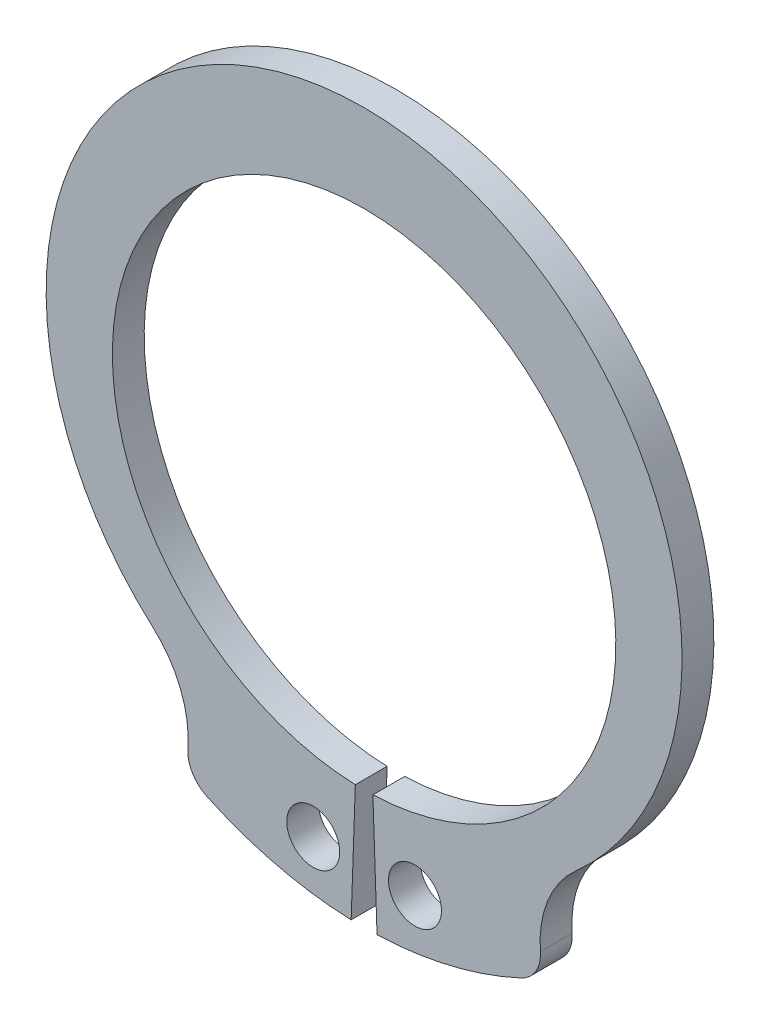
ISO-10303-21;
HEADER;
FILE_DESCRIPTION(('STEP AP214'),'2;1');
FILE_NAME('part.step','',(''),(''),'','','');
FILE_SCHEMA(('AUTOMOTIVE_DESIGN { 1 0 10303 214 1 1 1 1 }'));
ENDSEC;
DATA;
#1=APPLICATION_CONTEXT('core data for automotive mechanical design processes');
#2=APPLICATION_PROTOCOL_DEFINITION('international standard','automotive_design',2000,#1);
#3=PRODUCT_CONTEXT('',#1,'mechanical');
#4=PRODUCT('Part','Part','',(#3));
#5=PRODUCT_RELATED_PRODUCT_CATEGORY('part','',(#4));
#6=PRODUCT_DEFINITION_FORMATION('','',#4);
#7=PRODUCT_DEFINITION_CONTEXT('part definition',#1,'design');
#8=PRODUCT_DEFINITION('design','',#6,#7);
#9=PRODUCT_DEFINITION_SHAPE('','',#8);
#10=(LENGTH_UNIT() NAMED_UNIT(*) SI_UNIT(.MILLI.,.METRE.));
#11=(NAMED_UNIT(*) PLANE_ANGLE_UNIT() SI_UNIT($,.RADIAN.));
#12=(NAMED_UNIT(*) SI_UNIT($,.STERADIAN.) SOLID_ANGLE_UNIT());
#13=UNCERTAINTY_MEASURE_WITH_UNIT(LENGTH_MEASURE(1.E-05),#10,'distance_accuracy_value','');
#14=(GEOMETRIC_REPRESENTATION_CONTEXT(3) GLOBAL_UNCERTAINTY_ASSIGNED_CONTEXT((#13)) GLOBAL_UNIT_ASSIGNED_CONTEXT((#10,
#11,#12)) REPRESENTATION_CONTEXT('',''));
#15=CARTESIAN_POINT('',(0.,0.,0.));
#16=DIRECTION('',(0.,0.,1.));
#17=DIRECTION('',(1.,0.,0.));
#18=AXIS2_PLACEMENT_3D('',#15,#16,#17);
#19=CARTESIAN_POINT('',(10.6411285697582,-11.1484887229254,1.2));
#20=DIRECTION('',(0.,0.,-1.));
#21=DIRECTION('',(-1.,0.,0.));
#22=AXIS2_PLACEMENT_3D('',#19,#20,#21);
#23=CYLINDRICAL_SURFACE('',#22,4.);
#24=CARTESIAN_POINT('',(10.6411285697582,-11.1484887229254,0.));
#25=DIRECTION('',(0.,0.,1.));
#26=DIRECTION('',(1.,0.,0.));
#27=AXIS2_PLACEMENT_3D('',#24,#25,#26);
#28=CIRCLE('',#27,4.);
#29=CARTESIAN_POINT('',(7.98084642731865,-8.16136654219406,0.));
#30=VERTEX_POINT('',#29);
#31=CARTESIAN_POINT('',(6.65267252069166,-11.4521634579043,0.));
#32=VERTEX_POINT('',#31);
#33=EDGE_CURVE('E151',#30,#32,#28,.T.);
#34=ORIENTED_EDGE('',*,*,#33,.F.);
#35=DIRECTION('',(0.,0.,-1.));
#36=VECTOR('',#35,1.);
#37=CARTESIAN_POINT('',(7.98084642731865,-8.16136654219406,1.2));
#38=LINE('',#37,#36);
#39=CARTESIAN_POINT('',(7.98084642731865,-8.16136654219406,1.2));
#40=VERTEX_POINT('',#39);
#41=EDGE_CURVE('E11',#40,#30,#38,.T.);
#42=ORIENTED_EDGE('',*,*,#41,.F.);
#43=CARTESIAN_POINT('',(10.6411285697582,-11.1484887229254,1.2));
#44=DIRECTION('',(0.,0.,1.));
#45=DIRECTION('',(1.,0.,0.));
#46=AXIS2_PLACEMENT_3D('',#43,#44,#45);
#47=CIRCLE('',#46,4.);
#48=CARTESIAN_POINT('',(6.65267252069166,-11.4521634579043,1.2));
#49=VERTEX_POINT('',#48);
#50=EDGE_CURVE('E181',#40,#49,#47,.T.);
#51=ORIENTED_EDGE('',*,*,#50,.T.);
#52=DIRECTION('',(0.,0.,-1.));
#53=VECTOR('',#52,1.);
#54=CARTESIAN_POINT('',(6.65267252069166,-11.4521634579043,1.2));
#55=LINE('',#54,#53);
#56=EDGE_CURVE('E96',#49,#32,#55,.T.);
#57=ORIENTED_EDGE('',*,*,#56,.T.);
#58=EDGE_LOOP('',(#34,#42,#51,#57));
#59=FACE_BOUND('',#58,.T.);
#60=ADVANCED_FACE('F39',(#59),#23,.F.);
#61=CARTESIAN_POINT('',(0.,0.8,1.2));
#62=DIRECTION('',(0.,0.,-1.));
#63=DIRECTION('',(-1.,0.,0.));
#64=AXIS2_PLACEMENT_3D('',#61,#62,#63);
#65=CYLINDRICAL_SURFACE('',#64,12.);
#66=CARTESIAN_POINT('',(0.,0.8,0.));
#67=DIRECTION('',(0.,0.,1.));
#68=DIRECTION('',(1.,0.,0.));
#69=AXIS2_PLACEMENT_3D('',#66,#67,#68);
#70=CIRCLE('',#69,12.);
#71=CARTESIAN_POINT('',(-7.98084642731865,-8.16136654219406,0.));
#72=VERTEX_POINT('',#71);
#73=EDGE_CURVE('E154',#30,#72,#70,.T.);
#74=ORIENTED_EDGE('',*,*,#73,.T.);
#75=DIRECTION('',(0.,0.,-1.));
#76=VECTOR('',#75,1.);
#77=CARTESIAN_POINT('',(-7.98084642731865,-8.16136654219406,1.2));
#78=LINE('',#77,#76);
#79=CARTESIAN_POINT('',(-7.98084642731865,-8.16136654219406,1.2));
#80=VERTEX_POINT('',#79);
#81=EDGE_CURVE('E47',#80,#72,#78,.T.);
#82=ORIENTED_EDGE('',*,*,#81,.F.);
#83=CARTESIAN_POINT('',(0.,0.8,1.2));
#84=DIRECTION('',(0.,0.,1.));
#85=DIRECTION('',(1.,0.,0.));
#86=AXIS2_PLACEMENT_3D('',#83,#84,#85);
#87=CIRCLE('',#86,12.);
#88=EDGE_CURVE('E217',#40,#80,#87,.T.);
#89=ORIENTED_EDGE('',*,*,#88,.F.);
#90=ORIENTED_EDGE('',*,*,#41,.T.);
#91=EDGE_LOOP('',(#74,#82,#89,#90));
#92=FACE_BOUND('',#91,.T.);
#93=ADVANCED_FACE('F230',(#92),#65,.T.);
#94=CARTESIAN_POINT('',(-10.6411285697582,-11.1484887229254,1.2));
#95=DIRECTION('',(0.,0.,-1.));
#96=DIRECTION('',(-1.,0.,0.));
#97=AXIS2_PLACEMENT_3D('',#94,#95,#96);
#98=CYLINDRICAL_SURFACE('',#97,4.);
#99=CARTESIAN_POINT('',(-10.6411285697582,-11.1484887229254,0.));
#100=DIRECTION('',(0.,0.,1.));
#101=DIRECTION('',(1.,0.,0.));
#102=AXIS2_PLACEMENT_3D('',#99,#100,#101);
#103=CIRCLE('',#102,4.);
#104=CARTESIAN_POINT('',(-6.65267252069166,-11.4521634579043,0.));
#105=VERTEX_POINT('',#104);
#106=EDGE_CURVE('E156',#72,#105,#103,.F.);
#107=ORIENTED_EDGE('',*,*,#106,.T.);
#108=DIRECTION('',(0.,0.,-1.));
#109=VECTOR('',#108,1.);
#110=CARTESIAN_POINT('',(-6.65267252069166,-11.4521634579043,1.2));
#111=LINE('',#110,#109);
#112=CARTESIAN_POINT('',(-6.65267252069166,-11.4521634579043,1.2));
#113=VERTEX_POINT('',#112);
#114=EDGE_CURVE('E191',#113,#105,#111,.T.);
#115=ORIENTED_EDGE('',*,*,#114,.F.);
#116=CARTESIAN_POINT('',(-10.6411285697582,-11.1484887229254,1.2));
#117=DIRECTION('',(0.,0.,1.));
#118=DIRECTION('',(1.,0.,0.));
#119=AXIS2_PLACEMENT_3D('',#116,#117,#118);
#120=CIRCLE('',#119,4.);
#121=EDGE_CURVE('E199',#80,#113,#120,.F.);
#122=ORIENTED_EDGE('',*,*,#121,.F.);
#123=ORIENTED_EDGE('',*,*,#81,.T.);
#124=EDGE_LOOP('',(#107,#115,#122,#123));
#125=FACE_BOUND('',#124,.T.);
#126=ADVANCED_FACE('F197',(#125),#98,.F.);
#127=CARTESIAN_POINT('',(-5.40628000535836,-11.5470618125852,1.2));
#128=DIRECTION('',(0.,0.,-1.));
#129=DIRECTION('',(-1.,0.,0.));
#130=AXIS2_PLACEMENT_3D('',#127,#128,#129);
#131=CYLINDRICAL_SURFACE('',#130,1.25);
#132=CARTESIAN_POINT('',(-5.40628000535836,-11.5470618125852,0.));
#133=DIRECTION('',(0.,0.,1.));
#134=DIRECTION('',(1.,0.,0.));
#135=AXIS2_PLACEMENT_3D('',#132,#133,#134);
#136=CIRCLE('',#135,1.25);
#137=CARTESIAN_POINT('',(-5.93630745686408,-12.6791266961719,0.));
#138=VERTEX_POINT('',#137);
#139=EDGE_CURVE('E159',#138,#105,#136,.F.);
#140=ORIENTED_EDGE('',*,*,#139,.F.);
#141=DIRECTION('',(0.,0.,-1.));
#142=VECTOR('',#141,1.);
#143=CARTESIAN_POINT('',(-5.93630745686408,-12.6791266961719,1.2));
#144=LINE('',#143,#142);
#145=CARTESIAN_POINT('',(-5.93630745686408,-12.6791266961719,1.2));
#146=VERTEX_POINT('',#145);
#147=EDGE_CURVE('E189',#146,#138,#144,.T.);
#148=ORIENTED_EDGE('',*,*,#147,.F.);
#149=CARTESIAN_POINT('',(-5.40628000535836,-11.5470618125852,1.2));
#150=DIRECTION('',(0.,0.,1.));
#151=DIRECTION('',(1.,0.,0.));
#152=AXIS2_PLACEMENT_3D('',#149,#150,#151);
#153=CIRCLE('',#152,1.25);
#154=EDGE_CURVE('E212',#146,#113,#153,.F.);
#155=ORIENTED_EDGE('',*,*,#154,.T.);
#156=ORIENTED_EDGE('',*,*,#114,.T.);
#157=EDGE_LOOP('',(#140,#148,#155,#156));
#158=FACE_BOUND('',#157,.T.);
#159=ADVANCED_FACE('F208',(#158),#131,.T.);
#160=CARTESIAN_POINT('',(0.,0.,1.2));
#161=DIRECTION('',(0.,0.,-1.));
#162=DIRECTION('',(-1.,0.,0.));
#163=AXIS2_PLACEMENT_3D('',#160,#161,#162);
#164=CYLINDRICAL_SURFACE('',#163,14.);
#165=CARTESIAN_POINT('',(0.,0.,0.));
#166=DIRECTION('',(0.,0.,1.));
#167=DIRECTION('',(1.,0.,0.));
#168=AXIS2_PLACEMENT_3D('',#165,#166,#167);
#169=CIRCLE('',#168,14.);
#170=CARTESIAN_POINT('',(-0.488592953835013,-13.9914715782673,0.));
#171=VERTEX_POINT('',#170);
#172=EDGE_CURVE('E162',#138,#171,#169,.T.);
#173=ORIENTED_EDGE('',*,*,#172,.T.);
#174=DIRECTION('',(0.,0.,-1.));
#175=VECTOR('',#174,1.);
#176=CARTESIAN_POINT('',(-0.488592953835013,-13.9914715782673,1.2));
#177=LINE('',#176,#175);
#178=CARTESIAN_POINT('',(-0.488592953835013,-13.9914715782673,1.2));
#179=VERTEX_POINT('',#178);
#180=EDGE_CURVE('E187',#179,#171,#177,.T.);
#181=ORIENTED_EDGE('',*,*,#180,.F.);
#182=CARTESIAN_POINT('',(0.,0.,1.2));
#183=DIRECTION('',(0.,0.,1.));
#184=DIRECTION('',(1.,0.,0.));
#185=AXIS2_PLACEMENT_3D('',#182,#183,#184);
#186=CIRCLE('',#185,14.);
#187=EDGE_CURVE('E213',#146,#179,#186,.T.);
#188=ORIENTED_EDGE('',*,*,#187,.F.);
#189=ORIENTED_EDGE('',*,*,#147,.T.);
#190=EDGE_LOOP('',(#173,#181,#188,#189));
#191=FACE_BOUND('',#190,.T.);
#192=ADVANCED_FACE('F240',(#191),#164,.T.);
#193=CARTESIAN_POINT('',(0.,0.,1.2));
#194=DIRECTION('',(0.999390827019096,-0.0348994967025009,0.));
#195=DIRECTION('',(0.0348994967025009,0.999390827019096,0.));
#196=AXIS2_PLACEMENT_3D('',#193,#194,#195);
#197=PLANE('',#196);
#198=DIRECTION('',(-0.0348994967025009,-0.999390827019096,0.));
#199=VECTOR('',#198,1.);
#200=CARTESIAN_POINT('',(0.,0.,0.));
#201=LINE('',#200,#199);
#202=CARTESIAN_POINT('',(-0.331545218673759,-9.49421285668141,0.));
#203=VERTEX_POINT('',#202);
#204=EDGE_CURVE('E165',#203,#171,#201,.T.);
#205=ORIENTED_EDGE('',*,*,#204,.F.);
#206=DIRECTION('',(0.,0.,-1.));
#207=VECTOR('',#206,1.);
#208=CARTESIAN_POINT('',(-0.331545218673759,-9.49421285668141,1.2));
#209=LINE('',#208,#207);
#210=CARTESIAN_POINT('',(-0.331545218673759,-9.49421285668141,1.2));
#211=VERTEX_POINT('',#210);
#212=EDGE_CURVE('E185',#211,#203,#209,.T.);
#213=ORIENTED_EDGE('',*,*,#212,.F.);
#214=DIRECTION('',(-0.0348994967025009,-0.999390827019096,0.));
#215=VECTOR('',#214,1.);
#216=CARTESIAN_POINT('',(0.,0.,1.2));
#217=LINE('',#216,#215);
#218=EDGE_CURVE('E215',#211,#179,#217,.T.);
#219=ORIENTED_EDGE('',*,*,#218,.T.);
#220=ORIENTED_EDGE('',*,*,#180,.T.);
#221=EDGE_LOOP('',(#205,#213,#219,#220));
#222=FACE_BOUND('',#221,.T.);
#223=ADVANCED_FACE('F243',(#222),#197,.T.);
#224=CARTESIAN_POINT('',(0.,0.,1.2));
#225=DIRECTION('',(0.,0.,-1.));
#226=DIRECTION('',(-1.,0.,0.));
#227=AXIS2_PLACEMENT_3D('',#224,#225,#226);
#228=CYLINDRICAL_SURFACE('',#227,9.5);
#229=CARTESIAN_POINT('',(0.,0.,0.));
#230=DIRECTION('',(0.,0.,1.));
#231=DIRECTION('',(1.,0.,0.));
#232=AXIS2_PLACEMENT_3D('',#229,#230,#231);
#233=CIRCLE('',#232,9.5);
#234=CARTESIAN_POINT('',(0.331545218673761,-9.49421285668141,0.));
#235=VERTEX_POINT('',#234);
#236=EDGE_CURVE('E168',#235,#203,#233,.T.);
#237=ORIENTED_EDGE('',*,*,#236,.F.);
#238=DIRECTION('',(0.,0.,-1.));
#239=VECTOR('',#238,1.);
#240=CARTESIAN_POINT('',(0.331545218673761,-9.49421285668141,1.2));
#241=LINE('',#240,#239);
#242=CARTESIAN_POINT('',(0.331545218673761,-9.49421285668141,1.2));
#243=VERTEX_POINT('',#242);
#244=EDGE_CURVE('E137',#243,#235,#241,.T.);
#245=ORIENTED_EDGE('',*,*,#244,.F.);
#246=CARTESIAN_POINT('',(0.,0.,1.2));
#247=DIRECTION('',(0.,0.,1.));
#248=DIRECTION('',(1.,0.,0.));
#249=AXIS2_PLACEMENT_3D('',#246,#247,#248);
#250=CIRCLE('',#249,9.5);
#251=EDGE_CURVE('E130',#243,#211,#250,.T.);
#252=ORIENTED_EDGE('',*,*,#251,.T.);
#253=ORIENTED_EDGE('',*,*,#212,.T.);
#254=EDGE_LOOP('',(#237,#245,#252,#253));
#255=FACE_BOUND('',#254,.T.);
#256=ADVANCED_FACE('F224',(#255),#228,.F.);
#257=CARTESIAN_POINT('',(0.,0.,1.2));
#258=DIRECTION('',(0.999390827019096,0.0348994967025012,0.));
#259=DIRECTION('',(-0.0348994967025012,0.999390827019096,0.));
#260=AXIS2_PLACEMENT_3D('',#257,#258,#259);
#261=PLANE('',#260);
#262=DIRECTION('',(0.0348994967025012,-0.999390827019096,0.));
#263=VECTOR('',#262,1.);
#264=CARTESIAN_POINT('',(0.,0.,0.));
#265=LINE('',#264,#263);
#266=CARTESIAN_POINT('',(0.488592953835016,-13.9914715782673,0.));
#267=VERTEX_POINT('',#266);
#268=EDGE_CURVE('E136',#235,#267,#265,.T.);
#269=ORIENTED_EDGE('',*,*,#268,.T.);
#270=DIRECTION('',(0.,0.,-1.));
#271=VECTOR('',#270,1.);
#272=CARTESIAN_POINT('',(0.488592953835016,-13.9914715782673,1.2));
#273=LINE('',#272,#271);
#274=CARTESIAN_POINT('',(0.488592953835016,-13.9914715782673,1.2));
#275=VERTEX_POINT('',#274);
#276=EDGE_CURVE('E133',#275,#267,#273,.T.);
#277=ORIENTED_EDGE('',*,*,#276,.F.);
#278=DIRECTION('',(0.0348994967025012,-0.999390827019096,0.));
#279=VECTOR('',#278,1.);
#280=CARTESIAN_POINT('',(0.,0.,1.2));
#281=LINE('',#280,#279);
#282=EDGE_CURVE('E122',#243,#275,#281,.T.);
#283=ORIENTED_EDGE('',*,*,#282,.F.);
#284=ORIENTED_EDGE('',*,*,#244,.T.);
#285=EDGE_LOOP('',(#269,#277,#283,#284));
#286=FACE_BOUND('',#285,.T.);
#287=ADVANCED_FACE('F134',(#286),#261,.F.);
#288=CARTESIAN_POINT('',(0.,0.,1.2));
#289=DIRECTION('',(0.,0.,-1.));
#290=DIRECTION('',(-1.,0.,0.));
#291=AXIS2_PLACEMENT_3D('',#288,#289,#290);
#292=CYLINDRICAL_SURFACE('',#291,14.);
#293=CARTESIAN_POINT('',(0.,0.,0.));
#294=DIRECTION('',(0.,0.,1.));
#295=DIRECTION('',(1.,0.,0.));
#296=AXIS2_PLACEMENT_3D('',#293,#294,#295);
#297=CIRCLE('',#296,14.);
#298=CARTESIAN_POINT('',(5.93630745686408,-12.6791266961719,0.));
#299=VERTEX_POINT('',#298);
#300=EDGE_CURVE('E89',#267,#299,#297,.T.);
#301=ORIENTED_EDGE('',*,*,#300,.T.);
#302=DIRECTION('',(0.,0.,-1.));
#303=VECTOR('',#302,1.);
#304=CARTESIAN_POINT('',(5.93630745686408,-12.6791266961719,1.2));
#305=LINE('',#304,#303);
#306=CARTESIAN_POINT('',(5.93630745686408,-12.6791266961719,1.2));
#307=VERTEX_POINT('',#306);
#308=EDGE_CURVE('E138',#307,#299,#305,.T.);
#309=ORIENTED_EDGE('',*,*,#308,.F.);
#310=CARTESIAN_POINT('',(0.,0.,1.2));
#311=DIRECTION('',(0.,0.,1.));
#312=DIRECTION('',(1.,0.,0.));
#313=AXIS2_PLACEMENT_3D('',#310,#311,#312);
#314=CIRCLE('',#313,14.);
#315=EDGE_CURVE('E127',#275,#307,#314,.T.);
#316=ORIENTED_EDGE('',*,*,#315,.F.);
#317=ORIENTED_EDGE('',*,*,#276,.T.);
#318=EDGE_LOOP('',(#301,#309,#316,#317));
#319=FACE_BOUND('',#318,.T.);
#320=ADVANCED_FACE('F140',(#319),#292,.T.);
#321=CARTESIAN_POINT('',(-1.91966573129975,-11.9914715782673,1.2));
#322=DIRECTION('',(0.,0.,-1.));
#323=DIRECTION('',(-1.,0.,0.));
#324=AXIS2_PLACEMENT_3D('',#321,#322,#323);
#325=CYLINDRICAL_SURFACE('',#324,1.);
#326=CARTESIAN_POINT('',(-1.91966573129975,-11.9914715782673,1.2));
#327=DIRECTION('',(0.,0.,1.));
#328=DIRECTION('',(1.,0.,0.));
#329=AXIS2_PLACEMENT_3D('',#326,#327,#328);
#330=CIRCLE('',#329,1.);
#331=CARTESIAN_POINT('',(-0.919665731299753,-11.9914715782673,1.2));
#332=VERTEX_POINT('',#331);
#333=EDGE_CURVE('E142',#332,#332,#330,.F.);
#334=ORIENTED_EDGE('',*,*,#333,.F.);
#335=EDGE_LOOP('',(#334));
#336=FACE_BOUND('',#335,.T.);
#337=CARTESIAN_POINT('',(-1.91966573129975,-11.9914715782673,0.));
#338=DIRECTION('',(0.,0.,1.));
#339=DIRECTION('',(1.,0.,0.));
#340=AXIS2_PLACEMENT_3D('',#337,#338,#339);
#341=CIRCLE('',#340,1.);
#342=CARTESIAN_POINT('',(-0.919665731299753,-11.9914715782673,0.));
#343=VERTEX_POINT('',#342);
#344=EDGE_CURVE('E175',#343,#343,#341,.F.);
#345=ORIENTED_EDGE('',*,*,#344,.T.);
#346=EDGE_LOOP('',(#345));
#347=FACE_BOUND('',#346,.T.);
#348=ADVANCED_FACE('F254',(#336,#347),#325,.F.);
#349=CARTESIAN_POINT('',(5.40628000535836,-11.5470618125852,1.2));
#350=DIRECTION('',(0.,0.,-1.));
#351=DIRECTION('',(-1.,0.,0.));
#352=AXIS2_PLACEMENT_3D('',#349,#350,#351);
#353=CYLINDRICAL_SURFACE('',#352,1.25);
#354=CARTESIAN_POINT('',(5.40628000535836,-11.5470618125852,0.));
#355=DIRECTION('',(0.,0.,1.));
#356=DIRECTION('',(1.,0.,0.));
#357=AXIS2_PLACEMENT_3D('',#354,#355,#356);
#358=CIRCLE('',#357,1.25);
#359=EDGE_CURVE('E173',#299,#32,#358,.T.);
#360=ORIENTED_EDGE('',*,*,#359,.T.);
#361=ORIENTED_EDGE('',*,*,#56,.F.);
#362=CARTESIAN_POINT('',(5.40628000535836,-11.5470618125852,1.2));
#363=DIRECTION('',(0.,0.,1.));
#364=DIRECTION('',(1.,0.,0.));
#365=AXIS2_PLACEMENT_3D('',#362,#363,#364);
#366=CIRCLE('',#365,1.25);
#367=EDGE_CURVE('E55',#307,#49,#366,.T.);
#368=ORIENTED_EDGE('',*,*,#367,.F.);
#369=ORIENTED_EDGE('',*,*,#308,.T.);
#370=EDGE_LOOP('',(#360,#361,#368,#369));
#371=FACE_BOUND('',#370,.T.);
#372=ADVANCED_FACE('F228',(#371),#353,.T.);
#373=CARTESIAN_POINT('',(1.91966573129975,-11.9914715782673,1.2));
#374=DIRECTION('',(0.,0.,-1.));
#375=DIRECTION('',(-1.,0.,0.));
#376=AXIS2_PLACEMENT_3D('',#373,#374,#375);
#377=CYLINDRICAL_SURFACE('',#376,1.);
#378=CARTESIAN_POINT('',(1.91966573129975,-11.9914715782673,1.2));
#379=DIRECTION('',(0.,0.,1.));
#380=DIRECTION('',(1.,0.,0.));
#381=AXIS2_PLACEMENT_3D('',#378,#379,#380);
#382=CIRCLE('',#381,1.);
#383=CARTESIAN_POINT('',(2.91966573129975,-11.9914715782673,1.2));
#384=VERTEX_POINT('',#383);
#385=EDGE_CURVE('E148',#384,#384,#382,.T.);
#386=ORIENTED_EDGE('',*,*,#385,.T.);
#387=EDGE_LOOP('',(#386));
#388=FACE_BOUND('',#387,.T.);
#389=CARTESIAN_POINT('',(1.91966573129975,-11.9914715782673,0.));
#390=DIRECTION('',(0.,0.,1.));
#391=DIRECTION('',(1.,0.,0.));
#392=AXIS2_PLACEMENT_3D('',#389,#390,#391);
#393=CIRCLE('',#392,1.);
#394=CARTESIAN_POINT('',(2.91966573129975,-11.9914715782673,0.));
#395=VERTEX_POINT('',#394);
#396=EDGE_CURVE('E178',#395,#395,#393,.T.);
#397=ORIENTED_EDGE('',*,*,#396,.F.);
#398=EDGE_LOOP('',(#397));
#399=FACE_BOUND('',#398,.T.);
#400=ADVANCED_FACE('F257',(#388,#399),#377,.F.);
#401=CARTESIAN_POINT('',(0.,0.,1.2));
#402=DIRECTION('',(0.,0.,1.));
#403=DIRECTION('',(1.,0.,0.));
#404=AXIS2_PLACEMENT_3D('',#401,#402,#403);
#405=PLANE('',#404);
#406=ORIENTED_EDGE('',*,*,#50,.F.);
#407=ORIENTED_EDGE('',*,*,#88,.T.);
#408=ORIENTED_EDGE('',*,*,#121,.T.);
#409=ORIENTED_EDGE('',*,*,#154,.F.);
#410=ORIENTED_EDGE('',*,*,#187,.T.);
#411=ORIENTED_EDGE('',*,*,#218,.F.);
#412=ORIENTED_EDGE('',*,*,#251,.F.);
#413=ORIENTED_EDGE('',*,*,#282,.T.);
#414=ORIENTED_EDGE('',*,*,#315,.T.);
#415=ORIENTED_EDGE('',*,*,#367,.T.);
#416=EDGE_LOOP('',(#406,#407,#408,#409,#410,#411,#412,#413,#414,#415));
#417=FACE_BOUND('',#416,.T.);
#418=ORIENTED_EDGE('',*,*,#333,.T.);
#419=EDGE_LOOP('',(#418));
#420=FACE_BOUND('',#419,.T.);
#421=ORIENTED_EDGE('',*,*,#385,.F.);
#422=EDGE_LOOP('',(#421));
#423=FACE_BOUND('',#422,.T.);
#424=ADVANCED_FACE('F124',(#417,#420,#423),#405,.T.);
#425=CARTESIAN_POINT('',(0.,0.,0.));
#426=DIRECTION('',(0.,0.,1.));
#427=DIRECTION('',(1.,0.,0.));
#428=AXIS2_PLACEMENT_3D('',#425,#426,#427);
#429=PLANE('',#428);
#430=ORIENTED_EDGE('',*,*,#33,.T.);
#431=ORIENTED_EDGE('',*,*,#359,.F.);
#432=ORIENTED_EDGE('',*,*,#300,.F.);
#433=ORIENTED_EDGE('',*,*,#268,.F.);
#434=ORIENTED_EDGE('',*,*,#236,.T.);
#435=ORIENTED_EDGE('',*,*,#204,.T.);
#436=ORIENTED_EDGE('',*,*,#172,.F.);
#437=ORIENTED_EDGE('',*,*,#139,.T.);
#438=ORIENTED_EDGE('',*,*,#106,.F.);
#439=ORIENTED_EDGE('',*,*,#73,.F.);
#440=EDGE_LOOP('',(#430,#431,#432,#433,#434,#435,#436,#437,#438,#439));
#441=FACE_BOUND('',#440,.T.);
#442=ORIENTED_EDGE('',*,*,#344,.F.);
#443=EDGE_LOOP('',(#442));
#444=FACE_BOUND('',#443,.T.);
#445=ORIENTED_EDGE('',*,*,#396,.T.);
#446=EDGE_LOOP('',(#445));
#447=FACE_BOUND('',#446,.T.);
#448=ADVANCED_FACE('F203',(#441,#444,#447),#429,.F.);
#449=CLOSED_SHELL('',(#60,#93,#126,#159,#192,#223,#256,#287,#320,#348,#372,#400,#424,#448));
#450=MANIFOLD_SOLID_BREP('B2',#449);
#451=ADVANCED_BREP_SHAPE_REPRESENTATION('',(#18,#450),#14);
#452=SHAPE_DEFINITION_REPRESENTATION(#9,#451);
ENDSEC;
END-ISO-10303-21;
